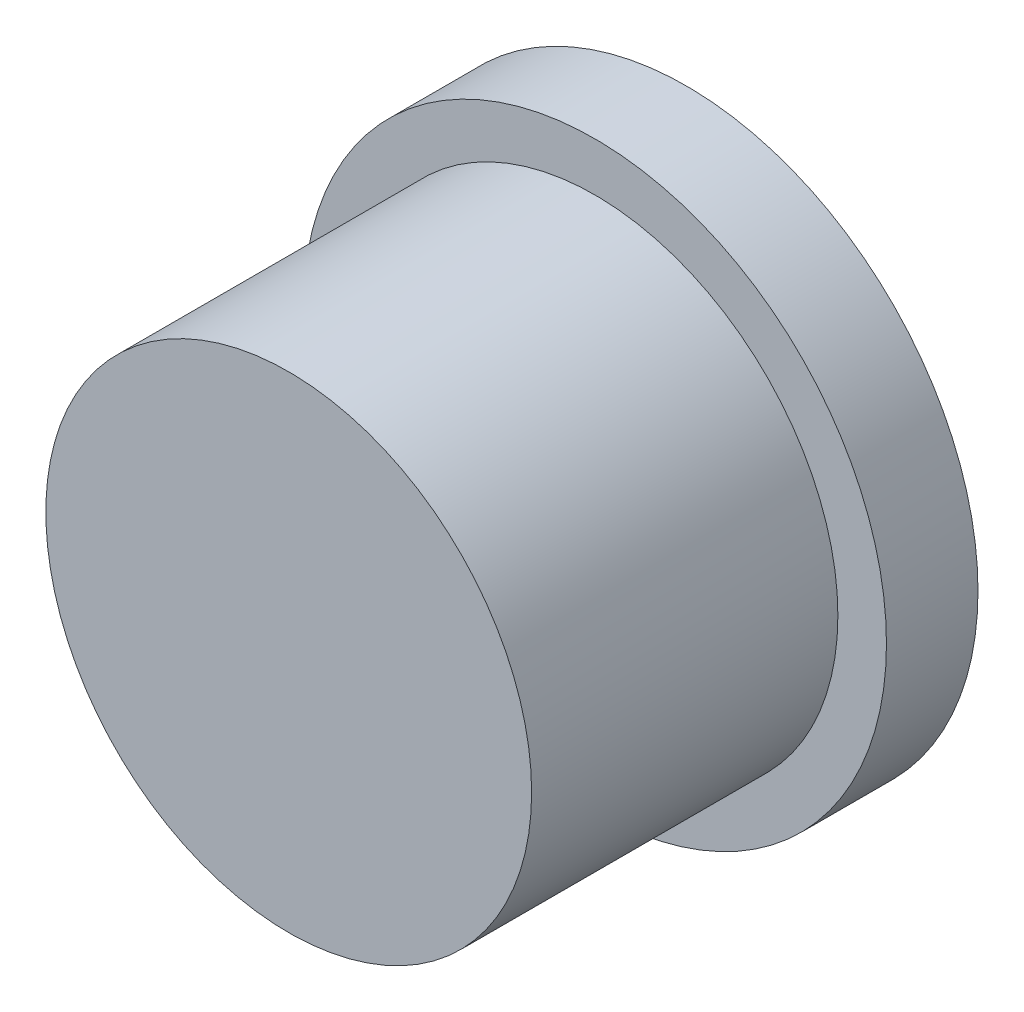
ISO-10303-21;
HEADER;
FILE_DESCRIPTION(('STEP AP214'),'2;1');
FILE_NAME('part.step','',(''),(''),'','','');
FILE_SCHEMA(('AUTOMOTIVE_DESIGN { 1 0 10303 214 1 1 1 1 }'));
ENDSEC;
DATA;
#1=APPLICATION_CONTEXT('core data for automotive mechanical design processes');
#2=APPLICATION_PROTOCOL_DEFINITION('international standard','automotive_design',2000,#1);
#3=PRODUCT_CONTEXT('',#1,'mechanical');
#4=PRODUCT('Part','Part','',(#3));
#5=PRODUCT_RELATED_PRODUCT_CATEGORY('part','',(#4));
#6=PRODUCT_DEFINITION_FORMATION('','',#4);
#7=PRODUCT_DEFINITION_CONTEXT('part definition',#1,'design');
#8=PRODUCT_DEFINITION('design','',#6,#7);
#9=PRODUCT_DEFINITION_SHAPE('','',#8);
#10=(LENGTH_UNIT() NAMED_UNIT(*) SI_UNIT(.MILLI.,.METRE.));
#11=(NAMED_UNIT(*) PLANE_ANGLE_UNIT() SI_UNIT($,.RADIAN.));
#12=(NAMED_UNIT(*) SI_UNIT($,.STERADIAN.) SOLID_ANGLE_UNIT());
#13=UNCERTAINTY_MEASURE_WITH_UNIT(LENGTH_MEASURE(1.E-05),#10,'distance_accuracy_value','');
#14=(GEOMETRIC_REPRESENTATION_CONTEXT(3) GLOBAL_UNCERTAINTY_ASSIGNED_CONTEXT((#13)) GLOBAL_UNIT_ASSIGNED_CONTEXT((#10,
#11,#12)) REPRESENTATION_CONTEXT('',''));
#15=CARTESIAN_POINT('',(0.,0.,0.));
#16=DIRECTION('',(0.,0.,1.));
#17=DIRECTION('',(1.,0.,0.));
#18=AXIS2_PLACEMENT_3D('',#15,#16,#17);
#19=CARTESIAN_POINT('',(0.,0.,1.19634));
#20=DIRECTION('',(0.,0.,-1.));
#21=DIRECTION('',(-1.,0.,0.));
#22=AXIS2_PLACEMENT_3D('',#19,#20,#21);
#23=CYLINDRICAL_SURFACE('',#22,3.81);
#24=CARTESIAN_POINT('',(0.,0.,1.19634));
#25=DIRECTION('',(0.,0.,1.));
#26=DIRECTION('',(1.,0.,0.));
#27=AXIS2_PLACEMENT_3D('',#24,#25,#26);
#28=CIRCLE('',#27,3.81);
#29=CARTESIAN_POINT('',(3.81,0.,1.19634));
#30=VERTEX_POINT('',#29);
#31=EDGE_CURVE('E38',#30,#30,#28,.T.);
#32=ORIENTED_EDGE('',*,*,#31,.F.);
#33=EDGE_LOOP('',(#32));
#34=FACE_BOUND('',#33,.T.);
#35=CARTESIAN_POINT('',(0.,0.,0.));
#36=DIRECTION('',(0.,0.,1.));
#37=DIRECTION('',(1.,0.,0.));
#38=AXIS2_PLACEMENT_3D('',#35,#36,#37);
#39=CIRCLE('',#38,3.81);
#40=CARTESIAN_POINT('',(3.81,0.,0.));
#41=VERTEX_POINT('',#40);
#42=EDGE_CURVE('E34',#41,#41,#39,.T.);
#43=ORIENTED_EDGE('',*,*,#42,.T.);
#44=EDGE_LOOP('',(#43));
#45=FACE_BOUND('',#44,.T.);
#46=ADVANCED_FACE('F31',(#34,#45),#23,.T.);
#47=CARTESIAN_POINT('',(0.,0.,1.19634));
#48=DIRECTION('',(0.,0.,1.));
#49=DIRECTION('',(1.,0.,0.));
#50=AXIS2_PLACEMENT_3D('',#47,#48,#49);
#51=PLANE('',#50);
#52=CARTESIAN_POINT('',(0.,0.,1.19634));
#53=DIRECTION('',(0.,0.,1.));
#54=DIRECTION('',(1.,0.,0.));
#55=AXIS2_PLACEMENT_3D('',#52,#53,#54);
#56=CIRCLE('',#55,3.175);
#57=CARTESIAN_POINT('',(3.175,0.,1.19634));
#58=VERTEX_POINT('',#57);
#59=EDGE_CURVE('E10',#58,#58,#56,.T.);
#60=ORIENTED_EDGE('',*,*,#59,.F.);
#61=EDGE_LOOP('',(#60));
#62=FACE_BOUND('',#61,.T.);
#63=ORIENTED_EDGE('',*,*,#31,.T.);
#64=EDGE_LOOP('',(#63));
#65=FACE_BOUND('',#64,.T.);
#66=ADVANCED_FACE('F55',(#62,#65),#51,.T.);
#67=CARTESIAN_POINT('',(0.,0.,0.));
#68=DIRECTION('',(0.,0.,1.));
#69=DIRECTION('',(1.,0.,0.));
#70=AXIS2_PLACEMENT_3D('',#67,#68,#69);
#71=PLANE('',#70);
#72=ORIENTED_EDGE('',*,*,#42,.F.);
#73=EDGE_LOOP('',(#72));
#74=FACE_BOUND('',#73,.T.);
#75=ADVANCED_FACE('F52',(#74),#71,.F.);
#76=CARTESIAN_POINT('',(0.,0.,5.19938));
#77=DIRECTION('',(0.,0.,-1.));
#78=DIRECTION('',(-1.,0.,0.));
#79=AXIS2_PLACEMENT_3D('',#76,#77,#78);
#80=CYLINDRICAL_SURFACE('',#79,3.175);
#81=CARTESIAN_POINT('',(0.,0.,5.19938));
#82=DIRECTION('',(0.,0.,1.));
#83=DIRECTION('',(1.,0.,0.));
#84=AXIS2_PLACEMENT_3D('',#81,#82,#83);
#85=CIRCLE('',#84,3.175);
#86=CARTESIAN_POINT('',(3.175,0.,5.19938));
#87=VERTEX_POINT('',#86);
#88=EDGE_CURVE('E44',#87,#87,#85,.T.);
#89=ORIENTED_EDGE('',*,*,#88,.F.);
#90=EDGE_LOOP('',(#89));
#91=FACE_BOUND('',#90,.T.);
#92=ORIENTED_EDGE('',*,*,#59,.T.);
#93=EDGE_LOOP('',(#92));
#94=FACE_BOUND('',#93,.T.);
#95=ADVANCED_FACE('F54',(#91,#94),#80,.T.);
#96=CARTESIAN_POINT('',(0.,0.,5.19938));
#97=DIRECTION('',(0.,0.,1.));
#98=DIRECTION('',(1.,0.,0.));
#99=AXIS2_PLACEMENT_3D('',#96,#97,#98);
#100=PLANE('',#99);
#101=ORIENTED_EDGE('',*,*,#88,.T.);
#102=EDGE_LOOP('',(#101));
#103=FACE_BOUND('',#102,.T.);
#104=ADVANCED_FACE('F60',(#103),#100,.T.);
#105=CLOSED_SHELL('',(#46,#66,#75,#95,#104));
#106=MANIFOLD_SOLID_BREP('B2',#105);
#107=ADVANCED_BREP_SHAPE_REPRESENTATION('',(#18,#106),#14);
#108=SHAPE_DEFINITION_REPRESENTATION(#9,#107);
ENDSEC;
END-ISO-10303-21;
